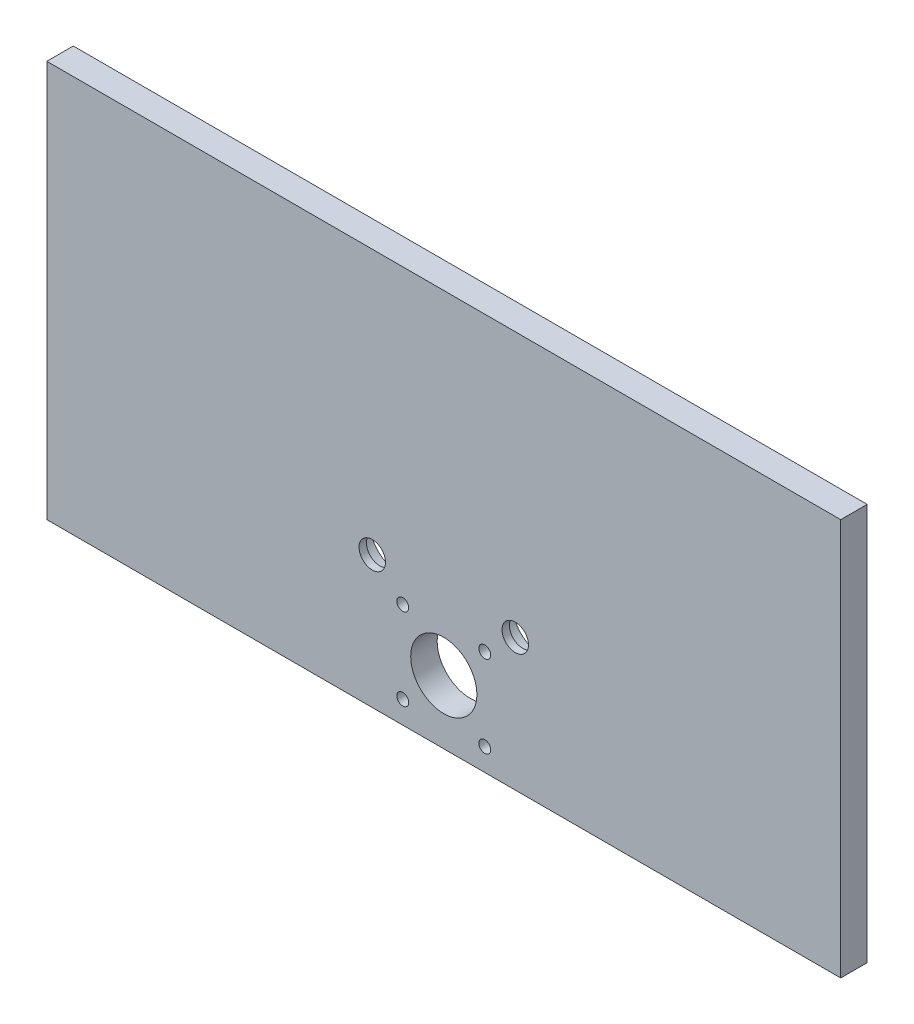
ISO-10303-21;
HEADER;
FILE_DESCRIPTION(('STEP AP214'),'2;1');
FILE_NAME('part.step','',(''),(''),'','','');
FILE_SCHEMA(('AUTOMOTIVE_DESIGN { 1 0 10303 214 1 1 1 1 }'));
ENDSEC;
DATA;
#1=APPLICATION_CONTEXT('core data for automotive mechanical design processes');
#2=APPLICATION_PROTOCOL_DEFINITION('international standard','automotive_design',2000,#1);
#3=PRODUCT_CONTEXT('',#1,'mechanical');
#4=PRODUCT('Part','Part','',(#3));
#5=PRODUCT_RELATED_PRODUCT_CATEGORY('part','',(#4));
#6=PRODUCT_DEFINITION_FORMATION('','',#4);
#7=PRODUCT_DEFINITION_CONTEXT('part definition',#1,'design');
#8=PRODUCT_DEFINITION('design','',#6,#7);
#9=PRODUCT_DEFINITION_SHAPE('','',#8);
#10=(LENGTH_UNIT() NAMED_UNIT(*) SI_UNIT(.MILLI.,.METRE.));
#11=(NAMED_UNIT(*) PLANE_ANGLE_UNIT() SI_UNIT($,.RADIAN.));
#12=(NAMED_UNIT(*) SI_UNIT($,.STERADIAN.) SOLID_ANGLE_UNIT());
#13=UNCERTAINTY_MEASURE_WITH_UNIT(LENGTH_MEASURE(1.E-05),#10,'distance_accuracy_value','');
#14=(GEOMETRIC_REPRESENTATION_CONTEXT(3) GLOBAL_UNCERTAINTY_ASSIGNED_CONTEXT((#13)) GLOBAL_UNIT_ASSIGNED_CONTEXT((#10,
#11,#12)) REPRESENTATION_CONTEXT('',''));
#15=CARTESIAN_POINT('',(0.,0.,0.));
#16=DIRECTION('',(0.,0.,1.));
#17=DIRECTION('',(1.,0.,0.));
#18=AXIS2_PLACEMENT_3D('',#15,#16,#17);
#19=CARTESIAN_POINT('',(-27.0137185030705,-25.,0.));
#20=DIRECTION('',(0.,0.,1.));
#21=DIRECTION('',(1.,0.,0.));
#22=AXIS2_PLACEMENT_3D('',#19,#20,#21);
#23=CYLINDRICAL_SURFACE('',#22,5.);
#24=CARTESIAN_POINT('',(-27.0137185030705,-25.,10.));
#25=DIRECTION('',(0.,0.,-1.));
#26=DIRECTION('',(-1.,0.,0.));
#27=AXIS2_PLACEMENT_3D('',#24,#25,#26);
#28=CIRCLE('',#27,5.);
#29=CARTESIAN_POINT('',(-32.0137185030705,-25.,10.));
#30=VERTEX_POINT('',#29);
#31=EDGE_CURVE('E124',#30,#30,#28,.T.);
#32=ORIENTED_EDGE('',*,*,#31,.F.);
#33=EDGE_LOOP('',(#32));
#34=FACE_BOUND('',#33,.T.);
#35=CARTESIAN_POINT('',(-27.0137185030705,-25.,7.2));
#36=DIRECTION('',(0.,0.,-1.));
#37=DIRECTION('',(-1.,0.,0.));
#38=AXIS2_PLACEMENT_3D('',#35,#36,#37);
#39=CIRCLE('',#38,5.);
#40=CARTESIAN_POINT('',(-32.0137185030705,-25.,7.2));
#41=VERTEX_POINT('',#40);
#42=EDGE_CURVE('E37',#41,#41,#39,.T.);
#43=ORIENTED_EDGE('',*,*,#42,.T.);
#44=EDGE_LOOP('',(#43));
#45=FACE_BOUND('',#44,.T.);
#46=ADVANCED_FACE('F33',(#34,#45),#23,.F.);
#47=CARTESIAN_POINT('',(27.0137185030705,-25.,0.));
#48=DIRECTION('',(0.,0.,1.));
#49=DIRECTION('',(1.,0.,0.));
#50=AXIS2_PLACEMENT_3D('',#47,#48,#49);
#51=CYLINDRICAL_SURFACE('',#50,5.);
#52=CARTESIAN_POINT('',(27.0137185030705,-25.,10.));
#53=DIRECTION('',(0.,0.,1.));
#54=DIRECTION('',(1.,0.,0.));
#55=AXIS2_PLACEMENT_3D('',#52,#53,#54);
#56=CIRCLE('',#55,5.);
#57=CARTESIAN_POINT('',(32.0137185030705,-25.,10.));
#58=VERTEX_POINT('',#57);
#59=EDGE_CURVE('E129',#58,#58,#56,.T.);
#60=ORIENTED_EDGE('',*,*,#59,.T.);
#61=EDGE_LOOP('',(#60));
#62=FACE_BOUND('',#61,.T.);
#63=CARTESIAN_POINT('',(27.0137185030705,-25.,7.2));
#64=DIRECTION('',(0.,0.,-1.));
#65=DIRECTION('',(-1.,0.,0.));
#66=AXIS2_PLACEMENT_3D('',#63,#64,#65);
#67=CIRCLE('',#66,5.);
#68=CARTESIAN_POINT('',(22.0137185030705,-25.,7.2));
#69=VERTEX_POINT('',#68);
#70=EDGE_CURVE('E122',#69,#69,#67,.F.);
#71=ORIENTED_EDGE('',*,*,#70,.F.);
#72=EDGE_LOOP('',(#71));
#73=FACE_BOUND('',#72,.T.);
#74=ADVANCED_FACE('F186',(#62,#73),#51,.F.);
#75=CARTESIAN_POINT('',(0.,0.,10.));
#76=DIRECTION('',(0.,0.,-1.));
#77=DIRECTION('',(-1.,0.,0.));
#78=AXIS2_PLACEMENT_3D('',#75,#76,#77);
#79=PLANE('',#78);
#80=DIRECTION('',(0.,1.,0.));
#81=VECTOR('',#80,1.);
#82=CARTESIAN_POINT('',(150.,-75.,10.));
#83=LINE('',#82,#81);
#84=CARTESIAN_POINT('',(150.,-75.,10.));
#85=VERTEX_POINT('',#84);
#86=CARTESIAN_POINT('',(150.,75.,10.));
#87=VERTEX_POINT('',#86);
#88=EDGE_CURVE('E88',#85,#87,#83,.T.);
#89=ORIENTED_EDGE('',*,*,#88,.T.);
#90=DIRECTION('',(-1.,0.,0.));
#91=VECTOR('',#90,1.);
#92=CARTESIAN_POINT('',(-150.,75.,10.));
#93=LINE('',#92,#91);
#94=CARTESIAN_POINT('',(-150.,75.,10.));
#95=VERTEX_POINT('',#94);
#96=EDGE_CURVE('E82',#87,#95,#93,.T.);
#97=ORIENTED_EDGE('',*,*,#96,.T.);
#98=DIRECTION('',(0.,-1.,0.));
#99=VECTOR('',#98,1.);
#100=CARTESIAN_POINT('',(-150.,-75.,10.));
#101=LINE('',#100,#99);
#102=CARTESIAN_POINT('',(-150.,-75.,10.));
#103=VERTEX_POINT('',#102);
#104=EDGE_CURVE('E86',#95,#103,#101,.T.);
#105=ORIENTED_EDGE('',*,*,#104,.T.);
#106=DIRECTION('',(1.,0.,0.));
#107=VECTOR('',#106,1.);
#108=CARTESIAN_POINT('',(-150.,-75.,10.));
#109=LINE('',#108,#107);
#110=EDGE_CURVE('E52',#103,#85,#109,.T.);
#111=ORIENTED_EDGE('',*,*,#110,.T.);
#112=EDGE_LOOP('',(#89,#97,#105,#111));
#113=FACE_BOUND('',#112,.T.);
#114=CARTESIAN_POINT('',(0.,-51.,10.));
#115=DIRECTION('',(0.,0.,-1.));
#116=DIRECTION('',(-1.,0.,0.));
#117=AXIS2_PLACEMENT_3D('',#114,#115,#116);
#118=CIRCLE('',#117,12.5);
#119=CARTESIAN_POINT('',(-12.5000000000001,-51.,10.));
#120=VERTEX_POINT('',#119);
#121=EDGE_CURVE('E104',#120,#120,#118,.T.);
#122=ORIENTED_EDGE('',*,*,#121,.T.);
#123=EDGE_LOOP('',(#122));
#124=FACE_BOUND('',#123,.T.);
#125=CARTESIAN_POINT('',(-15.5,-66.5,10.));
#126=DIRECTION('',(0.,0.,1.));
#127=DIRECTION('',(1.,0.,0.));
#128=AXIS2_PLACEMENT_3D('',#125,#126,#127);
#129=CIRCLE('',#128,2.25);
#130=CARTESIAN_POINT('',(-13.25,-66.5,10.));
#131=VERTEX_POINT('',#130);
#132=EDGE_CURVE('E113',#131,#131,#129,.T.);
#133=ORIENTED_EDGE('',*,*,#132,.F.);
#134=EDGE_LOOP('',(#133));
#135=FACE_BOUND('',#134,.T.);
#136=CARTESIAN_POINT('',(15.5,-66.5,10.));
#137=DIRECTION('',(0.,0.,1.));
#138=DIRECTION('',(1.,0.,0.));
#139=AXIS2_PLACEMENT_3D('',#136,#137,#138);
#140=CIRCLE('',#139,2.25);
#141=CARTESIAN_POINT('',(17.75,-66.5,10.));
#142=VERTEX_POINT('',#141);
#143=EDGE_CURVE('E114',#142,#142,#140,.T.);
#144=ORIENTED_EDGE('',*,*,#143,.F.);
#145=EDGE_LOOP('',(#144));
#146=FACE_BOUND('',#145,.T.);
#147=CARTESIAN_POINT('',(15.5,-35.5,10.));
#148=DIRECTION('',(0.,0.,1.));
#149=DIRECTION('',(1.,0.,0.));
#150=AXIS2_PLACEMENT_3D('',#147,#148,#149);
#151=CIRCLE('',#150,2.25);
#152=CARTESIAN_POINT('',(17.75,-35.5,10.));
#153=VERTEX_POINT('',#152);
#154=EDGE_CURVE('E118',#153,#153,#151,.T.);
#155=ORIENTED_EDGE('',*,*,#154,.F.);
#156=EDGE_LOOP('',(#155));
#157=FACE_BOUND('',#156,.T.);
#158=CARTESIAN_POINT('',(-15.5,-35.5,10.));
#159=DIRECTION('',(0.,0.,1.));
#160=DIRECTION('',(1.,0.,0.));
#161=AXIS2_PLACEMENT_3D('',#158,#159,#160);
#162=CIRCLE('',#161,2.25);
#163=CARTESIAN_POINT('',(-13.25,-35.5,10.));
#164=VERTEX_POINT('',#163);
#165=EDGE_CURVE('E121',#164,#164,#162,.T.);
#166=ORIENTED_EDGE('',*,*,#165,.F.);
#167=EDGE_LOOP('',(#166));
#168=FACE_BOUND('',#167,.T.);
#169=ORIENTED_EDGE('',*,*,#59,.F.);
#170=EDGE_LOOP('',(#169));
#171=FACE_BOUND('',#170,.T.);
#172=ORIENTED_EDGE('',*,*,#31,.T.);
#173=EDGE_LOOP('',(#172));
#174=FACE_BOUND('',#173,.T.);
#175=ADVANCED_FACE('F83',(#113,#124,#135,#146,#157,#168,#171,#174),#79,.F.);
#176=CARTESIAN_POINT('',(0.,0.,0.));
#177=DIRECTION('',(0.,0.,-1.));
#178=DIRECTION('',(-1.,0.,0.));
#179=AXIS2_PLACEMENT_3D('',#176,#177,#178);
#180=PLANE('',#179);
#181=CARTESIAN_POINT('',(-27.0137185030705,-25.,0.));
#182=DIRECTION('',(0.,0.,-1.));
#183=DIRECTION('',(-1.,0.,0.));
#184=AXIS2_PLACEMENT_3D('',#181,#182,#183);
#185=CIRCLE('',#184,11.);
#186=CARTESIAN_POINT('',(-38.0137185030705,-25.,0.));
#187=VERTEX_POINT('',#186);
#188=EDGE_CURVE('E139',#187,#187,#185,.T.);
#189=ORIENTED_EDGE('',*,*,#188,.F.);
#190=EDGE_LOOP('',(#189));
#191=FACE_BOUND('',#190,.T.);
#192=CARTESIAN_POINT('',(27.0137185030705,-25.,0.));
#193=DIRECTION('',(0.,0.,-1.));
#194=DIRECTION('',(-1.,0.,0.));
#195=AXIS2_PLACEMENT_3D('',#192,#193,#194);
#196=CIRCLE('',#195,11.);
#197=CARTESIAN_POINT('',(16.0137185030705,-25.,0.));
#198=VERTEX_POINT('',#197);
#199=EDGE_CURVE('E132',#198,#198,#196,.T.);
#200=ORIENTED_EDGE('',*,*,#199,.F.);
#201=EDGE_LOOP('',(#200));
#202=FACE_BOUND('',#201,.T.);
#203=DIRECTION('',(0.,1.,0.));
#204=VECTOR('',#203,1.);
#205=CARTESIAN_POINT('',(150.,-75.,0.));
#206=LINE('',#205,#204);
#207=CARTESIAN_POINT('',(150.,-75.,0.));
#208=VERTEX_POINT('',#207);
#209=CARTESIAN_POINT('',(150.,75.,0.));
#210=VERTEX_POINT('',#209);
#211=EDGE_CURVE('E101',#208,#210,#206,.T.);
#212=ORIENTED_EDGE('',*,*,#211,.F.);
#213=DIRECTION('',(1.,0.,0.));
#214=VECTOR('',#213,1.);
#215=CARTESIAN_POINT('',(-150.,-75.,0.));
#216=LINE('',#215,#214);
#217=CARTESIAN_POINT('',(-150.,-75.,0.));
#218=VERTEX_POINT('',#217);
#219=EDGE_CURVE('E75',#218,#208,#216,.T.);
#220=ORIENTED_EDGE('',*,*,#219,.F.);
#221=DIRECTION('',(0.,-1.,0.));
#222=VECTOR('',#221,1.);
#223=CARTESIAN_POINT('',(-150.,-75.,0.));
#224=LINE('',#223,#222);
#225=CARTESIAN_POINT('',(-150.,75.,0.));
#226=VERTEX_POINT('',#225);
#227=EDGE_CURVE('E69',#226,#218,#224,.T.);
#228=ORIENTED_EDGE('',*,*,#227,.F.);
#229=DIRECTION('',(-1.,0.,0.));
#230=VECTOR('',#229,1.);
#231=CARTESIAN_POINT('',(-150.,75.,0.));
#232=LINE('',#231,#230);
#233=EDGE_CURVE('E92',#210,#226,#232,.T.);
#234=ORIENTED_EDGE('',*,*,#233,.F.);
#235=EDGE_LOOP('',(#212,#220,#228,#234));
#236=FACE_BOUND('',#235,.T.);
#237=CARTESIAN_POINT('',(0.,-51.,0.));
#238=DIRECTION('',(0.,0.,-1.));
#239=DIRECTION('',(-1.,0.,0.));
#240=AXIS2_PLACEMENT_3D('',#237,#238,#239);
#241=CIRCLE('',#240,12.5);
#242=CARTESIAN_POINT('',(-12.5000000000001,-51.,0.));
#243=VERTEX_POINT('',#242);
#244=EDGE_CURVE('E155',#243,#243,#241,.T.);
#245=ORIENTED_EDGE('',*,*,#244,.F.);
#246=EDGE_LOOP('',(#245));
#247=FACE_BOUND('',#246,.T.);
#248=CARTESIAN_POINT('',(-15.5,-66.5,0.));
#249=DIRECTION('',(0.,0.,-1.));
#250=DIRECTION('',(-1.,0.,0.));
#251=AXIS2_PLACEMENT_3D('',#248,#249,#250);
#252=CIRCLE('',#251,2.25);
#253=CARTESIAN_POINT('',(-17.75,-66.5,0.));
#254=VERTEX_POINT('',#253);
#255=EDGE_CURVE('E152',#254,#254,#252,.T.);
#256=ORIENTED_EDGE('',*,*,#255,.F.);
#257=EDGE_LOOP('',(#256));
#258=FACE_BOUND('',#257,.T.);
#259=CARTESIAN_POINT('',(15.5,-66.5,0.));
#260=DIRECTION('',(0.,0.,-1.));
#261=DIRECTION('',(-1.,0.,0.));
#262=AXIS2_PLACEMENT_3D('',#259,#260,#261);
#263=CIRCLE('',#262,2.25);
#264=CARTESIAN_POINT('',(13.25,-66.5,0.));
#265=VERTEX_POINT('',#264);
#266=EDGE_CURVE('E110',#265,#265,#263,.T.);
#267=ORIENTED_EDGE('',*,*,#266,.F.);
#268=EDGE_LOOP('',(#267));
#269=FACE_BOUND('',#268,.T.);
#270=CARTESIAN_POINT('',(15.5,-35.5,0.));
#271=DIRECTION('',(0.,0.,-1.));
#272=DIRECTION('',(-1.,0.,0.));
#273=AXIS2_PLACEMENT_3D('',#270,#271,#272);
#274=CIRCLE('',#273,2.25);
#275=CARTESIAN_POINT('',(13.25,-35.5,0.));
#276=VERTEX_POINT('',#275);
#277=EDGE_CURVE('E115',#276,#276,#274,.T.);
#278=ORIENTED_EDGE('',*,*,#277,.F.);
#279=EDGE_LOOP('',(#278));
#280=FACE_BOUND('',#279,.T.);
#281=CARTESIAN_POINT('',(-15.5,-35.5,0.));
#282=DIRECTION('',(0.,0.,-1.));
#283=DIRECTION('',(-1.,0.,0.));
#284=AXIS2_PLACEMENT_3D('',#281,#282,#283);
#285=CIRCLE('',#284,2.25);
#286=CARTESIAN_POINT('',(-17.75,-35.5,0.));
#287=VERTEX_POINT('',#286);
#288=EDGE_CURVE('E119',#287,#287,#285,.T.);
#289=ORIENTED_EDGE('',*,*,#288,.F.);
#290=EDGE_LOOP('',(#289));
#291=FACE_BOUND('',#290,.T.);
#292=ADVANCED_FACE('F163',(#191,#202,#236,#247,#258,#269,#280,#291),#180,.T.);
#293=CARTESIAN_POINT('',(150.,-75.,10.));
#294=DIRECTION('',(-1.,0.,0.));
#295=DIRECTION('',(0.,0.,1.));
#296=AXIS2_PLACEMENT_3D('',#293,#294,#295);
#297=PLANE('',#296);
#298=ORIENTED_EDGE('',*,*,#211,.T.);
#299=DIRECTION('',(0.,0.,-1.));
#300=VECTOR('',#299,1.);
#301=CARTESIAN_POINT('',(150.,75.,10.));
#302=LINE('',#301,#300);
#303=EDGE_CURVE('E11',#87,#210,#302,.T.);
#304=ORIENTED_EDGE('',*,*,#303,.F.);
#305=ORIENTED_EDGE('',*,*,#88,.F.);
#306=DIRECTION('',(0.,0.,-1.));
#307=VECTOR('',#306,1.);
#308=CARTESIAN_POINT('',(150.,-75.,10.));
#309=LINE('',#308,#307);
#310=EDGE_CURVE('E97',#85,#208,#309,.T.);
#311=ORIENTED_EDGE('',*,*,#310,.T.);
#312=EDGE_LOOP('',(#298,#304,#305,#311));
#313=FACE_BOUND('',#312,.T.);
#314=ADVANCED_FACE('F35',(#313),#297,.F.);
#315=CARTESIAN_POINT('',(-150.,75.,10.));
#316=DIRECTION('',(0.,-1.,0.));
#317=DIRECTION('',(0.,0.,-1.));
#318=AXIS2_PLACEMENT_3D('',#315,#316,#317);
#319=PLANE('',#318);
#320=ORIENTED_EDGE('',*,*,#233,.T.);
#321=DIRECTION('',(0.,0.,-1.));
#322=VECTOR('',#321,1.);
#323=CARTESIAN_POINT('',(-150.,75.,10.));
#324=LINE('',#323,#322);
#325=EDGE_CURVE('E43',#95,#226,#324,.T.);
#326=ORIENTED_EDGE('',*,*,#325,.F.);
#327=ORIENTED_EDGE('',*,*,#96,.F.);
#328=ORIENTED_EDGE('',*,*,#303,.T.);
#329=EDGE_LOOP('',(#320,#326,#327,#328));
#330=FACE_BOUND('',#329,.T.);
#331=ADVANCED_FACE('F91',(#330),#319,.F.);
#332=CARTESIAN_POINT('',(-150.,-75.,10.));
#333=DIRECTION('',(1.,0.,0.));
#334=DIRECTION('',(0.,0.,-1.));
#335=AXIS2_PLACEMENT_3D('',#332,#333,#334);
#336=PLANE('',#335);
#337=ORIENTED_EDGE('',*,*,#227,.T.);
#338=DIRECTION('',(0.,0.,-1.));
#339=VECTOR('',#338,1.);
#340=CARTESIAN_POINT('',(-150.,-75.,10.));
#341=LINE('',#340,#339);
#342=EDGE_CURVE('E93',#103,#218,#341,.T.);
#343=ORIENTED_EDGE('',*,*,#342,.F.);
#344=ORIENTED_EDGE('',*,*,#104,.F.);
#345=ORIENTED_EDGE('',*,*,#325,.T.);
#346=EDGE_LOOP('',(#337,#343,#344,#345));
#347=FACE_BOUND('',#346,.T.);
#348=ADVANCED_FACE('F95',(#347),#336,.F.);
#349=CARTESIAN_POINT('',(-150.,-75.,10.));
#350=DIRECTION('',(0.,1.,0.));
#351=DIRECTION('',(0.,0.,1.));
#352=AXIS2_PLACEMENT_3D('',#349,#350,#351);
#353=PLANE('',#352);
#354=ORIENTED_EDGE('',*,*,#219,.T.);
#355=ORIENTED_EDGE('',*,*,#310,.F.);
#356=ORIENTED_EDGE('',*,*,#110,.F.);
#357=ORIENTED_EDGE('',*,*,#342,.T.);
#358=EDGE_LOOP('',(#354,#355,#356,#357));
#359=FACE_BOUND('',#358,.T.);
#360=ADVANCED_FACE('F211',(#359),#353,.F.);
#361=CARTESIAN_POINT('',(0.,-51.,10.));
#362=DIRECTION('',(0.,0.,-1.));
#363=DIRECTION('',(-1.,0.,0.));
#364=AXIS2_PLACEMENT_3D('',#361,#362,#363);
#365=CYLINDRICAL_SURFACE('',#364,12.5);
#366=ORIENTED_EDGE('',*,*,#121,.F.);
#367=EDGE_LOOP('',(#366));
#368=FACE_BOUND('',#367,.T.);
#369=ORIENTED_EDGE('',*,*,#244,.T.);
#370=EDGE_LOOP('',(#369));
#371=FACE_BOUND('',#370,.T.);
#372=ADVANCED_FACE('F161',(#368,#371),#365,.F.);
#373=CARTESIAN_POINT('',(-15.5,-66.5,10.));
#374=DIRECTION('',(0.,0.,1.));
#375=DIRECTION('',(1.,0.,0.));
#376=AXIS2_PLACEMENT_3D('',#373,#374,#375);
#377=CYLINDRICAL_SURFACE('',#376,2.25);
#378=ORIENTED_EDGE('',*,*,#255,.T.);
#379=EDGE_LOOP('',(#378));
#380=FACE_BOUND('',#379,.T.);
#381=ORIENTED_EDGE('',*,*,#132,.T.);
#382=EDGE_LOOP('',(#381));
#383=FACE_BOUND('',#382,.T.);
#384=ADVANCED_FACE('F218',(#380,#383),#377,.F.);
#385=CARTESIAN_POINT('',(15.5,-66.5,10.));
#386=DIRECTION('',(0.,0.,1.));
#387=DIRECTION('',(1.,0.,0.));
#388=AXIS2_PLACEMENT_3D('',#385,#386,#387);
#389=CYLINDRICAL_SURFACE('',#388,2.25);
#390=ORIENTED_EDGE('',*,*,#266,.T.);
#391=EDGE_LOOP('',(#390));
#392=FACE_BOUND('',#391,.T.);
#393=ORIENTED_EDGE('',*,*,#143,.T.);
#394=EDGE_LOOP('',(#393));
#395=FACE_BOUND('',#394,.T.);
#396=ADVANCED_FACE('F257',(#392,#395),#389,.F.);
#397=CARTESIAN_POINT('',(15.5,-35.5,10.));
#398=DIRECTION('',(0.,0.,1.));
#399=DIRECTION('',(1.,0.,0.));
#400=AXIS2_PLACEMENT_3D('',#397,#398,#399);
#401=CYLINDRICAL_SURFACE('',#400,2.25);
#402=ORIENTED_EDGE('',*,*,#277,.T.);
#403=EDGE_LOOP('',(#402));
#404=FACE_BOUND('',#403,.T.);
#405=ORIENTED_EDGE('',*,*,#154,.T.);
#406=EDGE_LOOP('',(#405));
#407=FACE_BOUND('',#406,.T.);
#408=ADVANCED_FACE('F180',(#404,#407),#401,.F.);
#409=CARTESIAN_POINT('',(-15.5,-35.5,10.));
#410=DIRECTION('',(0.,0.,1.));
#411=DIRECTION('',(1.,0.,0.));
#412=AXIS2_PLACEMENT_3D('',#409,#410,#411);
#413=CYLINDRICAL_SURFACE('',#412,2.25);
#414=ORIENTED_EDGE('',*,*,#288,.T.);
#415=EDGE_LOOP('',(#414));
#416=FACE_BOUND('',#415,.T.);
#417=ORIENTED_EDGE('',*,*,#165,.T.);
#418=EDGE_LOOP('',(#417));
#419=FACE_BOUND('',#418,.T.);
#420=ADVANCED_FACE('F176',(#416,#419),#413,.F.);
#421=CARTESIAN_POINT('',(27.0137185030705,-25.,7.2));
#422=DIRECTION('',(0.,0.,-1.));
#423=DIRECTION('',(-1.,0.,0.));
#424=AXIS2_PLACEMENT_3D('',#421,#422,#423);
#425=PLANE('',#424);
#426=CARTESIAN_POINT('',(27.0137185030705,-25.,7.2));
#427=DIRECTION('',(0.,0.,-1.));
#428=DIRECTION('',(-1.,0.,0.));
#429=AXIS2_PLACEMENT_3D('',#426,#427,#428);
#430=CIRCLE('',#429,11.);
#431=CARTESIAN_POINT('',(16.0137185030705,-25.,7.2));
#432=VERTEX_POINT('',#431);
#433=EDGE_CURVE('E125',#432,#432,#430,.T.);
#434=ORIENTED_EDGE('',*,*,#433,.T.);
#435=EDGE_LOOP('',(#434));
#436=FACE_BOUND('',#435,.T.);
#437=ORIENTED_EDGE('',*,*,#70,.T.);
#438=EDGE_LOOP('',(#437));
#439=FACE_BOUND('',#438,.T.);
#440=ADVANCED_FACE('F179',(#436,#439),#425,.T.);
#441=CARTESIAN_POINT('',(27.0137185030705,-25.,7.2));
#442=DIRECTION('',(0.,0.,-1.));
#443=DIRECTION('',(-1.,0.,0.));
#444=AXIS2_PLACEMENT_3D('',#441,#442,#443);
#445=CYLINDRICAL_SURFACE('',#444,11.);
#446=ORIENTED_EDGE('',*,*,#433,.F.);
#447=EDGE_LOOP('',(#446));
#448=FACE_BOUND('',#447,.T.);
#449=ORIENTED_EDGE('',*,*,#199,.T.);
#450=EDGE_LOOP('',(#449));
#451=FACE_BOUND('',#450,.T.);
#452=ADVANCED_FACE('F314',(#448,#451),#445,.F.);
#453=CARTESIAN_POINT('',(-27.0137185030705,-25.,7.2));
#454=DIRECTION('',(0.,0.,-1.));
#455=DIRECTION('',(-1.,0.,0.));
#456=AXIS2_PLACEMENT_3D('',#453,#454,#455);
#457=CYLINDRICAL_SURFACE('',#456,11.);
#458=CARTESIAN_POINT('',(-27.0137185030705,-25.,7.2));
#459=DIRECTION('',(0.,0.,-1.));
#460=DIRECTION('',(-1.,0.,0.));
#461=AXIS2_PLACEMENT_3D('',#458,#459,#460);
#462=CIRCLE('',#461,11.);
#463=CARTESIAN_POINT('',(-38.0137185030705,-25.,7.2));
#464=VERTEX_POINT('',#463);
#465=EDGE_CURVE('E198',#464,#464,#462,.T.);
#466=ORIENTED_EDGE('',*,*,#465,.F.);
#467=EDGE_LOOP('',(#466));
#468=FACE_BOUND('',#467,.T.);
#469=ORIENTED_EDGE('',*,*,#188,.T.);
#470=EDGE_LOOP('',(#469));
#471=FACE_BOUND('',#470,.T.);
#472=ADVANCED_FACE('F205',(#468,#471),#457,.F.);
#473=CARTESIAN_POINT('',(-27.0137185030705,-25.,7.2));
#474=DIRECTION('',(0.,0.,-1.));
#475=DIRECTION('',(-1.,0.,0.));
#476=AXIS2_PLACEMENT_3D('',#473,#474,#475);
#477=PLANE('',#476);
#478=ORIENTED_EDGE('',*,*,#42,.F.);
#479=EDGE_LOOP('',(#478));
#480=FACE_BOUND('',#479,.T.);
#481=ORIENTED_EDGE('',*,*,#465,.T.);
#482=EDGE_LOOP('',(#481));
#483=FACE_BOUND('',#482,.T.);
#484=ADVANCED_FACE('F332',(#480,#483),#477,.T.);
#485=CLOSED_SHELL('',(#46,#74,#175,#292,#314,#331,#348,#360,#372,#384,#396,#408,#420,#440,#452,
#472,#484));
#486=MANIFOLD_SOLID_BREP('B2',#485);
#487=ADVANCED_BREP_SHAPE_REPRESENTATION('',(#18,#486),#14);
#488=SHAPE_DEFINITION_REPRESENTATION(#9,#487);
ENDSEC;
END-ISO-10303-21;
